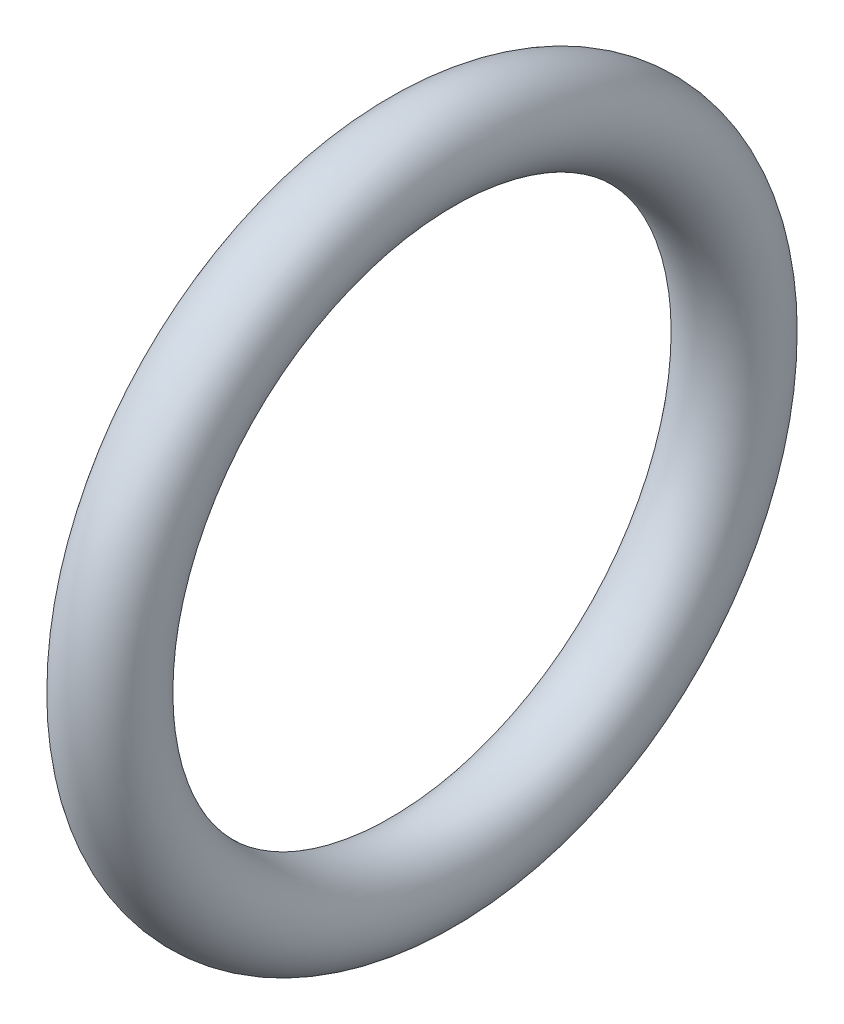
ISO-10303-21;
HEADER;
FILE_DESCRIPTION(('STEP AP214'),'2;1');
FILE_NAME('part.step','',(''),(''),'','','');
FILE_SCHEMA(('AUTOMOTIVE_DESIGN { 1 0 10303 214 1 1 1 1 }'));
ENDSEC;
DATA;
#1=APPLICATION_CONTEXT('core data for automotive mechanical design processes');
#2=APPLICATION_PROTOCOL_DEFINITION('international standard','automotive_design',2000,#1);
#3=PRODUCT_CONTEXT('',#1,'mechanical');
#4=PRODUCT('Part','Part','',(#3));
#5=PRODUCT_RELATED_PRODUCT_CATEGORY('part','',(#4));
#6=PRODUCT_DEFINITION_FORMATION('','',#4);
#7=PRODUCT_DEFINITION_CONTEXT('part definition',#1,'design');
#8=PRODUCT_DEFINITION('design','',#6,#7);
#9=PRODUCT_DEFINITION_SHAPE('','',#8);
#10=(LENGTH_UNIT() NAMED_UNIT(*) SI_UNIT(.MILLI.,.METRE.));
#11=(NAMED_UNIT(*) PLANE_ANGLE_UNIT() SI_UNIT($,.RADIAN.));
#12=(NAMED_UNIT(*) SI_UNIT($,.STERADIAN.) SOLID_ANGLE_UNIT());
#13=UNCERTAINTY_MEASURE_WITH_UNIT(LENGTH_MEASURE(1.E-05),#10,'distance_accuracy_value','');
#14=(GEOMETRIC_REPRESENTATION_CONTEXT(3) GLOBAL_UNCERTAINTY_ASSIGNED_CONTEXT((#13)) GLOBAL_UNIT_ASSIGNED_CONTEXT((#10,
#11,#12)) REPRESENTATION_CONTEXT('',''));
#15=CARTESIAN_POINT('',(0.,0.,0.));
#16=DIRECTION('',(0.,0.,1.));
#17=DIRECTION('',(1.,0.,0.));
#18=AXIS2_PLACEMENT_3D('',#15,#16,#17);
#19=CARTESIAN_POINT('',(0.,0.,0.));
#20=DIRECTION('',(-1.,0.,0.));
#21=DIRECTION('',(0.,0.,1.));
#22=AXIS2_PLACEMENT_3D('',#19,#20,#21);
#23=TOROIDAL_SURFACE('',#22,3.5,0.500000000000001);
#24=CARTESIAN_POINT('',(0.,0.,4.));
#25=VERTEX_POINT('',#24);
#26=VERTEX_LOOP('',#25);
#27=FACE_BOUND('',#26,.T.);
#28=ADVANCED_FACE('F37',(#27),#23,.T.);
#29=CLOSED_SHELL('',(#28));
#30=MANIFOLD_SOLID_BREP('B2',#29);
#31=ADVANCED_BREP_SHAPE_REPRESENTATION('',(#18,#30),#14);
#32=SHAPE_DEFINITION_REPRESENTATION(#9,#31);
ENDSEC;
END-ISO-10303-21;
